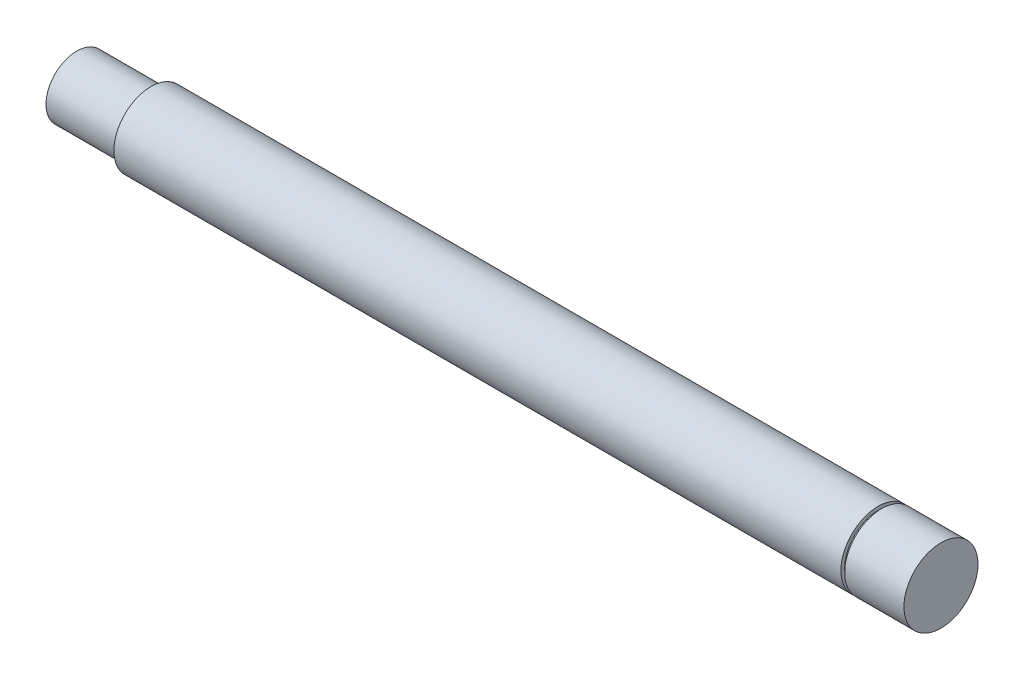
ISO-10303-21;
HEADER;
FILE_DESCRIPTION(('STEP AP214'),'2;1');
FILE_NAME('part.step','',(''),(''),'','','');
FILE_SCHEMA(('AUTOMOTIVE_DESIGN { 1 0 10303 214 1 1 1 1 }'));
ENDSEC;
DATA;
#1=APPLICATION_CONTEXT('core data for automotive mechanical design processes');
#2=APPLICATION_PROTOCOL_DEFINITION('international standard','automotive_design',2000,#1);
#3=PRODUCT_CONTEXT('',#1,'mechanical');
#4=PRODUCT('Part','Part','',(#3));
#5=PRODUCT_RELATED_PRODUCT_CATEGORY('part','',(#4));
#6=PRODUCT_DEFINITION_FORMATION('','',#4);
#7=PRODUCT_DEFINITION_CONTEXT('part definition',#1,'design');
#8=PRODUCT_DEFINITION('design','',#6,#7);
#9=PRODUCT_DEFINITION_SHAPE('','',#8);
#10=(LENGTH_UNIT() NAMED_UNIT(*) SI_UNIT(.MILLI.,.METRE.));
#11=(NAMED_UNIT(*) PLANE_ANGLE_UNIT() SI_UNIT($,.RADIAN.));
#12=(NAMED_UNIT(*) SI_UNIT($,.STERADIAN.) SOLID_ANGLE_UNIT());
#13=UNCERTAINTY_MEASURE_WITH_UNIT(LENGTH_MEASURE(1.E-05),#10,'distance_accuracy_value','');
#14=(GEOMETRIC_REPRESENTATION_CONTEXT(3) GLOBAL_UNCERTAINTY_ASSIGNED_CONTEXT((#13)) GLOBAL_UNIT_ASSIGNED_CONTEXT((#10,
#11,#12)) REPRESENTATION_CONTEXT('',''));
#15=CARTESIAN_POINT('',(0.,0.,0.));
#16=DIRECTION('',(0.,0.,1.));
#17=DIRECTION('',(1.,0.,0.));
#18=AXIS2_PLACEMENT_3D('',#15,#16,#17);
#19=CARTESIAN_POINT('',(175.,0.,0.));
#20=DIRECTION('',(-1.,0.,0.));
#21=DIRECTION('',(0.,0.,1.));
#22=AXIS2_PLACEMENT_3D('',#19,#20,#21);
#23=CYLINDRICAL_SURFACE('',#22,7.5);
#24=CARTESIAN_POINT('',(162.25,0.,0.));
#25=DIRECTION('',(1.,0.,0.));
#26=DIRECTION('',(0.,0.,-1.));
#27=AXIS2_PLACEMENT_3D('',#24,#25,#26);
#28=CIRCLE('',#27,7.5);
#29=CARTESIAN_POINT('',(162.25,0.,-7.5));
#30=VERTEX_POINT('',#29);
#31=EDGE_CURVE('E44',#30,#30,#28,.T.);
#32=ORIENTED_EDGE('',*,*,#31,.F.);
#33=EDGE_LOOP('',(#32));
#34=FACE_BOUND('',#33,.T.);
#35=CARTESIAN_POINT('',(15.,0.,0.));
#36=DIRECTION('',(-1.,0.,0.));
#37=DIRECTION('',(0.,0.,1.));
#38=AXIS2_PLACEMENT_3D('',#35,#36,#37);
#39=CIRCLE('',#38,7.5);
#40=CARTESIAN_POINT('',(15.,0.,7.5));
#41=VERTEX_POINT('',#40);
#42=EDGE_CURVE('E58',#41,#41,#39,.T.);
#43=ORIENTED_EDGE('',*,*,#42,.F.);
#44=EDGE_LOOP('',(#43));
#45=FACE_BOUND('',#44,.T.);
#46=ADVANCED_FACE('F37',(#34,#45),#23,.T.);
#47=CARTESIAN_POINT('',(162.25,0.,0.));
#48=DIRECTION('',(1.,0.,0.));
#49=DIRECTION('',(0.,0.,-1.));
#50=AXIS2_PLACEMENT_3D('',#47,#48,#49);
#51=PLANE('',#50);
#52=CARTESIAN_POINT('',(162.25,0.,0.));
#53=DIRECTION('',(1.,0.,0.));
#54=DIRECTION('',(0.,0.,-1.));
#55=AXIS2_PLACEMENT_3D('',#52,#53,#54);
#56=CIRCLE('',#55,6.75);
#57=CARTESIAN_POINT('',(162.25,0.,-6.75));
#58=VERTEX_POINT('',#57);
#59=EDGE_CURVE('E53',#58,#58,#56,.T.);
#60=ORIENTED_EDGE('',*,*,#59,.F.);
#61=EDGE_LOOP('',(#60));
#62=FACE_BOUND('',#61,.T.);
#63=ORIENTED_EDGE('',*,*,#31,.T.);
#64=EDGE_LOOP('',(#63));
#65=FACE_BOUND('',#64,.T.);
#66=ADVANCED_FACE('F80',(#62,#65),#51,.T.);
#67=CARTESIAN_POINT('',(163.,0.,0.));
#68=DIRECTION('',(1.,0.,0.));
#69=DIRECTION('',(0.,0.,-1.));
#70=AXIS2_PLACEMENT_3D('',#67,#68,#69);
#71=PLANE('',#70);
#72=CARTESIAN_POINT('',(163.,0.,0.));
#73=DIRECTION('',(1.,0.,0.));
#74=DIRECTION('',(0.,0.,-1.));
#75=AXIS2_PLACEMENT_3D('',#72,#73,#74);
#76=CIRCLE('',#75,6.75);
#77=CARTESIAN_POINT('',(163.,0.,-6.75));
#78=VERTEX_POINT('',#77);
#79=EDGE_CURVE('E55',#78,#78,#76,.T.);
#80=ORIENTED_EDGE('',*,*,#79,.T.);
#81=EDGE_LOOP('',(#80));
#82=FACE_BOUND('',#81,.T.);
#83=CARTESIAN_POINT('',(163.,0.,0.));
#84=DIRECTION('',(1.,0.,0.));
#85=DIRECTION('',(0.,0.,-1.));
#86=AXIS2_PLACEMENT_3D('',#83,#84,#85);
#87=CIRCLE('',#86,7.5);
#88=CARTESIAN_POINT('',(163.,0.,-7.5));
#89=VERTEX_POINT('',#88);
#90=EDGE_CURVE('E48',#89,#89,#87,.T.);
#91=ORIENTED_EDGE('',*,*,#90,.F.);
#92=EDGE_LOOP('',(#91));
#93=FACE_BOUND('',#92,.T.);
#94=ADVANCED_FACE('F85',(#82,#93),#71,.F.);
#95=CARTESIAN_POINT('',(162.25,0.,0.));
#96=DIRECTION('',(1.,0.,0.));
#97=DIRECTION('',(0.,0.,-1.));
#98=AXIS2_PLACEMENT_3D('',#95,#96,#97);
#99=CYLINDRICAL_SURFACE('',#98,6.75);
#100=ORIENTED_EDGE('',*,*,#59,.T.);
#101=EDGE_LOOP('',(#100));
#102=FACE_BOUND('',#101,.T.);
#103=ORIENTED_EDGE('',*,*,#79,.F.);
#104=EDGE_LOOP('',(#103));
#105=FACE_BOUND('',#104,.T.);
#106=ADVANCED_FACE('F94',(#102,#105),#99,.T.);
#107=CARTESIAN_POINT('',(175.,0.,0.));
#108=DIRECTION('',(1.,0.,0.));
#109=DIRECTION('',(0.,0.,-1.));
#110=AXIS2_PLACEMENT_3D('',#107,#108,#109);
#111=PLANE('',#110);
#112=CARTESIAN_POINT('',(175.,0.,0.));
#113=DIRECTION('',(1.,0.,0.));
#114=DIRECTION('',(0.,0.,-1.));
#115=AXIS2_PLACEMENT_3D('',#112,#113,#114);
#116=CIRCLE('',#115,7.5);
#117=CARTESIAN_POINT('',(175.,0.,-7.5));
#118=VERTEX_POINT('',#117);
#119=EDGE_CURVE('E10',#118,#118,#116,.T.);
#120=ORIENTED_EDGE('',*,*,#119,.T.);
#121=EDGE_LOOP('',(#120));
#122=FACE_BOUND('',#121,.T.);
#123=ADVANCED_FACE('F89',(#122),#111,.T.);
#124=ORIENTED_EDGE('',*,*,#90,.T.);
#125=EDGE_LOOP('',(#124));
#126=FACE_BOUND('',#125,.T.);
#127=ORIENTED_EDGE('',*,*,#119,.F.);
#128=EDGE_LOOP('',(#127));
#129=FACE_BOUND('',#128,.T.);
#130=ADVANCED_FACE('F39',(#126,#129),#23,.T.);
#131=CARTESIAN_POINT('',(15.,0.,0.));
#132=DIRECTION('',(-1.,0.,0.));
#133=DIRECTION('',(0.,0.,1.));
#134=AXIS2_PLACEMENT_3D('',#131,#132,#133);
#135=PLANE('',#134);
#136=CARTESIAN_POINT('',(15.,0.,0.));
#137=DIRECTION('',(-1.,0.,0.));
#138=DIRECTION('',(0.,0.,1.));
#139=AXIS2_PLACEMENT_3D('',#136,#137,#138);
#140=CIRCLE('',#139,6.25);
#141=CARTESIAN_POINT('',(15.,0.,6.25));
#142=VERTEX_POINT('',#141);
#143=EDGE_CURVE('E63',#142,#142,#140,.T.);
#144=ORIENTED_EDGE('',*,*,#143,.F.);
#145=EDGE_LOOP('',(#144));
#146=FACE_BOUND('',#145,.T.);
#147=ORIENTED_EDGE('',*,*,#42,.T.);
#148=EDGE_LOOP('',(#147));
#149=FACE_BOUND('',#148,.T.);
#150=ADVANCED_FACE('F73',(#146,#149),#135,.T.);
#151=CARTESIAN_POINT('',(15.,0.,0.));
#152=DIRECTION('',(-1.,0.,0.));
#153=DIRECTION('',(0.,0.,1.));
#154=AXIS2_PLACEMENT_3D('',#151,#152,#153);
#155=CYLINDRICAL_SURFACE('',#154,6.25);
#156=ORIENTED_EDGE('',*,*,#143,.T.);
#157=EDGE_LOOP('',(#156));
#158=FACE_BOUND('',#157,.T.);
#159=CARTESIAN_POINT('',(0.,0.,0.));
#160=DIRECTION('',(-1.,0.,0.));
#161=DIRECTION('',(0.,0.,1.));
#162=AXIS2_PLACEMENT_3D('',#159,#160,#161);
#163=CIRCLE('',#162,6.25);
#164=CARTESIAN_POINT('',(0.,0.,6.25));
#165=VERTEX_POINT('',#164);
#166=EDGE_CURVE('E64',#165,#165,#163,.T.);
#167=ORIENTED_EDGE('',*,*,#166,.F.);
#168=EDGE_LOOP('',(#167));
#169=FACE_BOUND('',#168,.T.);
#170=ADVANCED_FACE('F70',(#158,#169),#155,.T.);
#171=CARTESIAN_POINT('',(0.,0.,0.));
#172=DIRECTION('',(1.,0.,0.));
#173=DIRECTION('',(0.,0.,-1.));
#174=AXIS2_PLACEMENT_3D('',#171,#172,#173);
#175=PLANE('',#174);
#176=ORIENTED_EDGE('',*,*,#166,.T.);
#177=EDGE_LOOP('',(#176));
#178=FACE_BOUND('',#177,.T.);
#179=ADVANCED_FACE('F107',(#178),#175,.F.);
#180=CLOSED_SHELL('',(#46,#66,#94,#106,#123,#130,#150,#170,#179));
#181=MANIFOLD_SOLID_BREP('B2',#180);
#182=ADVANCED_BREP_SHAPE_REPRESENTATION('',(#18,#181),#14);
#183=SHAPE_DEFINITION_REPRESENTATION(#9,#182);
ENDSEC;
END-ISO-10303-21;
